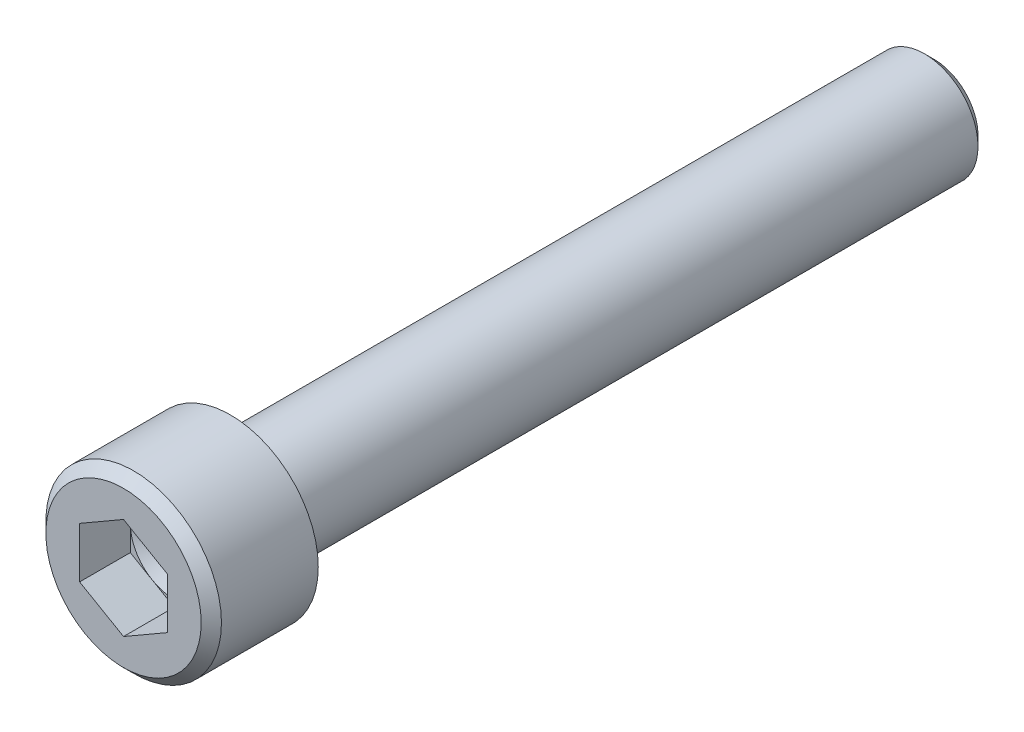
ISO-10303-21;
HEADER;
FILE_DESCRIPTION(('STEP AP214'),'2;1');
FILE_NAME('part.step','',(''),(''),'','','');
FILE_SCHEMA(('AUTOMOTIVE_DESIGN { 1 0 10303 214 1 1 1 1 }'));
ENDSEC;
DATA;
#1=APPLICATION_CONTEXT('core data for automotive mechanical design processes');
#2=APPLICATION_PROTOCOL_DEFINITION('international standard','automotive_design',2000,#1);
#3=PRODUCT_CONTEXT('',#1,'mechanical');
#4=PRODUCT('Part','Part','',(#3));
#5=PRODUCT_RELATED_PRODUCT_CATEGORY('part','',(#4));
#6=PRODUCT_DEFINITION_FORMATION('','',#4);
#7=PRODUCT_DEFINITION_CONTEXT('part definition',#1,'design');
#8=PRODUCT_DEFINITION('design','',#6,#7);
#9=PRODUCT_DEFINITION_SHAPE('','',#8);
#10=(LENGTH_UNIT() NAMED_UNIT(*) SI_UNIT(.MILLI.,.METRE.));
#11=(NAMED_UNIT(*) PLANE_ANGLE_UNIT() SI_UNIT($,.RADIAN.));
#12=(NAMED_UNIT(*) SI_UNIT($,.STERADIAN.) SOLID_ANGLE_UNIT());
#13=UNCERTAINTY_MEASURE_WITH_UNIT(LENGTH_MEASURE(1.E-05),#10,'distance_accuracy_value','');
#14=(GEOMETRIC_REPRESENTATION_CONTEXT(3) GLOBAL_UNCERTAINTY_ASSIGNED_CONTEXT((#13)) GLOBAL_UNIT_ASSIGNED_CONTEXT((#10,
#11,#12)) REPRESENTATION_CONTEXT('',''));
#15=CARTESIAN_POINT('',(0.,0.,0.));
#16=DIRECTION('',(0.,0.,1.));
#17=DIRECTION('',(1.,0.,0.));
#18=AXIS2_PLACEMENT_3D('',#15,#16,#17);
#19=CARTESIAN_POINT('',(0.,0.,2.54));
#20=DIRECTION('',(0.,0.,1.));
#21=DIRECTION('',(1.,0.,0.));
#22=AXIS2_PLACEMENT_3D('',#19,#20,#21);
#23=PLANE('',#22);
#24=DIRECTION('',(0.,1.,0.));
#25=VECTOR('',#24,1.);
#26=CARTESIAN_POINT('',(-1.9812,0.,2.54));
#27=LINE('',#26,#25);
#28=CARTESIAN_POINT('',(-1.9812,0.,2.54));
#29=VERTEX_POINT('',#28);
#30=CARTESIAN_POINT('',(-1.9812,1.14384635331848,2.54));
#31=VERTEX_POINT('',#30);
#32=EDGE_CURVE('E396',#29,#31,#27,.T.);
#33=ORIENTED_EDGE('',*,*,#32,.F.);
#34=CARTESIAN_POINT('',(0.,0.,2.54));
#35=DIRECTION('',(0.,0.,-1.));
#36=DIRECTION('',(-1.,0.,0.));
#37=AXIS2_PLACEMENT_3D('',#34,#35,#36);
#38=CIRCLE('',#37,1.9812);
#39=CARTESIAN_POINT('',(-0.9906,1.71576952997773,2.54));
#40=VERTEX_POINT('',#39);
#41=EDGE_CURVE('E33',#29,#40,#38,.T.);
#42=ORIENTED_EDGE('',*,*,#41,.T.);
#43=DIRECTION('',(0.866025403784439,0.5,0.));
#44=VECTOR('',#43,1.);
#45=CARTESIAN_POINT('',(0.163354175866616,2.38200528404682,2.54));
#46=LINE('',#45,#44);
#47=EDGE_CURVE('E391',#31,#40,#46,.T.);
#48=ORIENTED_EDGE('',*,*,#47,.F.);
#49=EDGE_LOOP('',(#33,#42,#48));
#50=FACE_BOUND('',#49,.T.);
#51=ADVANCED_FACE('F17',(#50),#23,.T.);
#52=CARTESIAN_POINT('',(0.,2.28769270663697,2.54));
#53=VERTEX_POINT('',#52);
#54=EDGE_CURVE('E389',#40,#53,#46,.T.);
#55=ORIENTED_EDGE('',*,*,#54,.F.);
#56=CARTESIAN_POINT('',(0.9906,1.71576952997773,2.54));
#57=VERTEX_POINT('',#56);
#58=EDGE_CURVE('E224',#40,#57,#38,.T.);
#59=ORIENTED_EDGE('',*,*,#58,.T.);
#60=DIRECTION('',(0.866025403784439,-0.5,0.));
#61=VECTOR('',#60,1.);
#62=CARTESIAN_POINT('',(-0.163354175866613,2.38200528404681,2.54));
#63=LINE('',#62,#61);
#64=EDGE_CURVE('E381',#53,#57,#63,.T.);
#65=ORIENTED_EDGE('',*,*,#64,.F.);
#66=EDGE_LOOP('',(#55,#59,#65));
#67=FACE_BOUND('',#66,.T.);
#68=ADVANCED_FACE('F105',(#67),#23,.T.);
#69=CARTESIAN_POINT('',(1.9812,1.14384635331849,2.54));
#70=VERTEX_POINT('',#69);
#71=EDGE_CURVE('E189',#57,#70,#63,.T.);
#72=ORIENTED_EDGE('',*,*,#71,.F.);
#73=CARTESIAN_POINT('',(1.9812,0.,2.54));
#74=VERTEX_POINT('',#73);
#75=EDGE_CURVE('E378',#57,#74,#38,.T.);
#76=ORIENTED_EDGE('',*,*,#75,.T.);
#77=DIRECTION('',(0.,-1.,0.));
#78=VECTOR('',#77,1.);
#79=CARTESIAN_POINT('',(1.9812,0.,2.54));
#80=LINE('',#79,#78);
#81=EDGE_CURVE('E159',#70,#74,#80,.T.);
#82=ORIENTED_EDGE('',*,*,#81,.F.);
#83=EDGE_LOOP('',(#72,#76,#82));
#84=FACE_BOUND('',#83,.T.);
#85=ADVANCED_FACE('F111',(#84),#23,.T.);
#86=CARTESIAN_POINT('',(1.9812,-1.14384635331849,2.54));
#87=VERTEX_POINT('',#86);
#88=EDGE_CURVE('E155',#74,#87,#80,.T.);
#89=ORIENTED_EDGE('',*,*,#88,.F.);
#90=CARTESIAN_POINT('',(0.9906,-1.71576952997773,2.54));
#91=VERTEX_POINT('',#90);
#92=EDGE_CURVE('E415',#74,#91,#38,.T.);
#93=ORIENTED_EDGE('',*,*,#92,.T.);
#94=DIRECTION('',(-0.866025403784438,-0.5,0.));
#95=VECTOR('',#94,1.);
#96=CARTESIAN_POINT('',(2.14455417586661,-1.04953377590865,2.54));
#97=LINE('',#96,#95);
#98=EDGE_CURVE('E148',#87,#91,#97,.T.);
#99=ORIENTED_EDGE('',*,*,#98,.F.);
#100=EDGE_LOOP('',(#89,#93,#99));
#101=FACE_BOUND('',#100,.T.);
#102=ADVANCED_FACE('F129',(#101),#23,.T.);
#103=CARTESIAN_POINT('',(0.,-2.28769270663697,2.54));
#104=VERTEX_POINT('',#103);
#105=EDGE_CURVE('E141',#91,#104,#97,.T.);
#106=ORIENTED_EDGE('',*,*,#105,.F.);
#107=CARTESIAN_POINT('',(-0.9906,-1.71576952997773,2.54));
#108=VERTEX_POINT('',#107);
#109=EDGE_CURVE('E143',#91,#108,#38,.T.);
#110=ORIENTED_EDGE('',*,*,#109,.T.);
#111=DIRECTION('',(-0.866025403784439,0.5,0.));
#112=VECTOR('',#111,1.);
#113=CARTESIAN_POINT('',(-2.14455417586661,-1.04953377590865,2.54));
#114=LINE('',#113,#112);
#115=EDGE_CURVE('E145',#104,#108,#114,.T.);
#116=ORIENTED_EDGE('',*,*,#115,.F.);
#117=EDGE_LOOP('',(#106,#110,#116));
#118=FACE_BOUND('',#117,.T.);
#119=ADVANCED_FACE('F119',(#118),#23,.T.);
#120=CARTESIAN_POINT('',(0.,0.,4.826));
#121=DIRECTION('',(0.,0.,1.));
#122=DIRECTION('',(1.,0.,0.));
#123=AXIS2_PLACEMENT_3D('',#120,#121,#122);
#124=PLANE('',#123);
#125=CARTESIAN_POINT('',(0.,0.,4.826));
#126=DIRECTION('',(0.,0.,1.));
#127=DIRECTION('',(1.,0.,0.));
#128=AXIS2_PLACEMENT_3D('',#125,#126,#127);
#129=CIRCLE('',#128,3.5052);
#130=CARTESIAN_POINT('',(3.5052,0.,4.826));
#131=VERTEX_POINT('',#130);
#132=EDGE_CURVE('E210',#131,#131,#129,.T.);
#133=ORIENTED_EDGE('',*,*,#132,.T.);
#134=EDGE_LOOP('',(#133));
#135=FACE_BOUND('',#134,.T.);
#136=DIRECTION('',(0.866025403784439,0.5,0.));
#137=VECTOR('',#136,1.);
#138=CARTESIAN_POINT('',(0.163354175866616,2.38200528404682,4.826));
#139=LINE('',#138,#137);
#140=CARTESIAN_POINT('',(-1.9812,1.14384635331848,4.826));
#141=VERTEX_POINT('',#140);
#142=CARTESIAN_POINT('',(0.,2.28769270663697,4.826));
#143=VERTEX_POINT('',#142);
#144=EDGE_CURVE('E171',#141,#143,#139,.T.);
#145=ORIENTED_EDGE('',*,*,#144,.T.);
#146=DIRECTION('',(0.866025403784439,-0.5,0.));
#147=VECTOR('',#146,1.);
#148=CARTESIAN_POINT('',(-0.163354175866613,2.38200528404681,4.826));
#149=LINE('',#148,#147);
#150=CARTESIAN_POINT('',(1.9812,1.14384635331849,4.826));
#151=VERTEX_POINT('',#150);
#152=EDGE_CURVE('E167',#143,#151,#149,.T.);
#153=ORIENTED_EDGE('',*,*,#152,.T.);
#154=DIRECTION('',(0.,-1.,0.));
#155=VECTOR('',#154,1.);
#156=CARTESIAN_POINT('',(1.9812,0.,4.826));
#157=LINE('',#156,#155);
#158=CARTESIAN_POINT('',(1.9812,-1.14384635331849,4.826));
#159=VERTEX_POINT('',#158);
#160=EDGE_CURVE('E185',#151,#159,#157,.T.);
#161=ORIENTED_EDGE('',*,*,#160,.T.);
#162=DIRECTION('',(-0.866025403784438,-0.5,0.));
#163=VECTOR('',#162,1.);
#164=CARTESIAN_POINT('',(2.14455417586661,-1.04953377590865,4.826));
#165=LINE('',#164,#163);
#166=CARTESIAN_POINT('',(0.,-2.28769270663697,4.826));
#167=VERTEX_POINT('',#166);
#168=EDGE_CURVE('E41',#159,#167,#165,.T.);
#169=ORIENTED_EDGE('',*,*,#168,.T.);
#170=DIRECTION('',(-0.866025403784439,0.5,0.));
#171=VECTOR('',#170,1.);
#172=CARTESIAN_POINT('',(-2.14455417586661,-1.04953377590865,4.826));
#173=LINE('',#172,#171);
#174=CARTESIAN_POINT('',(-1.9812,-1.14384635331849,4.826));
#175=VERTEX_POINT('',#174);
#176=EDGE_CURVE('E179',#167,#175,#173,.T.);
#177=ORIENTED_EDGE('',*,*,#176,.T.);
#178=DIRECTION('',(0.,1.,0.));
#179=VECTOR('',#178,1.);
#180=CARTESIAN_POINT('',(-1.9812,0.,4.826));
#181=LINE('',#180,#179);
#182=EDGE_CURVE('E175',#175,#141,#181,.T.);
#183=ORIENTED_EDGE('',*,*,#182,.T.);
#184=EDGE_LOOP('',(#145,#153,#161,#169,#177,#183));
#185=FACE_BOUND('',#184,.T.);
#186=ADVANCED_FACE('F128',(#135,#185),#124,.T.);
#187=CARTESIAN_POINT('',(0.,0.,4.826));
#188=DIRECTION('',(0.,0.,-1.));
#189=DIRECTION('',(-1.,0.,0.));
#190=AXIS2_PLACEMENT_3D('',#187,#188,#189);
#191=CYLINDRICAL_SURFACE('',#190,3.9624);
#192=CARTESIAN_POINT('',(0.,0.,4.3688));
#193=DIRECTION('',(0.,0.,1.));
#194=DIRECTION('',(1.,0.,0.));
#195=AXIS2_PLACEMENT_3D('',#192,#193,#194);
#196=CIRCLE('',#195,3.9624);
#197=CARTESIAN_POINT('',(3.9624,0.,4.3688));
#198=VERTEX_POINT('',#197);
#199=EDGE_CURVE('E214',#198,#198,#196,.F.);
#200=ORIENTED_EDGE('',*,*,#199,.T.);
#201=EDGE_LOOP('',(#200));
#202=FACE_BOUND('',#201,.T.);
#203=CARTESIAN_POINT('',(0.,0.,0.));
#204=DIRECTION('',(0.,0.,1.));
#205=DIRECTION('',(1.,0.,0.));
#206=AXIS2_PLACEMENT_3D('',#203,#204,#205);
#207=CIRCLE('',#206,3.9624);
#208=CARTESIAN_POINT('',(3.9624,0.,0.));
#209=VERTEX_POINT('',#208);
#210=EDGE_CURVE('E206',#209,#209,#207,.T.);
#211=ORIENTED_EDGE('',*,*,#210,.T.);
#212=EDGE_LOOP('',(#211));
#213=FACE_BOUND('',#212,.T.);
#214=ADVANCED_FACE('F134',(#202,#213),#191,.T.);
#215=CARTESIAN_POINT('',(0.,0.,0.));
#216=DIRECTION('',(0.,0.,1.));
#217=DIRECTION('',(1.,0.,0.));
#218=AXIS2_PLACEMENT_3D('',#215,#216,#217);
#219=PLANE('',#218);
#220=CARTESIAN_POINT('',(0.,0.,0.));
#221=DIRECTION('',(0.,0.,1.));
#222=DIRECTION('',(1.,0.,0.));
#223=AXIS2_PLACEMENT_3D('',#220,#221,#222);
#224=CIRCLE('',#223,2.5654);
#225=CARTESIAN_POINT('',(2.5654,0.,0.));
#226=VERTEX_POINT('',#225);
#227=EDGE_CURVE('E223',#226,#226,#224,.T.);
#228=ORIENTED_EDGE('',*,*,#227,.T.);
#229=EDGE_LOOP('',(#228));
#230=FACE_BOUND('',#229,.T.);
#231=ORIENTED_EDGE('',*,*,#210,.F.);
#232=EDGE_LOOP('',(#231));
#233=FACE_BOUND('',#232,.T.);
#234=ADVANCED_FACE('F322',(#230,#233),#219,.F.);
#235=CARTESIAN_POINT('',(0.,0.,4.826));
#236=DIRECTION('',(0.,0.,-1.));
#237=DIRECTION('',(-1.,0.,0.));
#238=AXIS2_PLACEMENT_3D('',#235,#236,#237);
#239=CONICAL_SURFACE('',#238,3.5052,0.785398163397449);
#240=ORIENTED_EDGE('',*,*,#199,.F.);
#241=EDGE_LOOP('',(#240));
#242=FACE_BOUND('',#241,.T.);
#243=ORIENTED_EDGE('',*,*,#132,.F.);
#244=EDGE_LOOP('',(#243));
#245=FACE_BOUND('',#244,.T.);
#246=ADVANCED_FACE('F313',(#242,#245),#239,.T.);
#247=CARTESIAN_POINT('',(-0.163354175866613,2.38200528404681,2.54));
#248=DIRECTION('',(-0.5,-0.866025403784439,0.));
#249=DIRECTION('',(0.866025403784439,-0.5,0.));
#250=AXIS2_PLACEMENT_3D('',#247,#248,#249);
#251=PLANE('',#250);
#252=ORIENTED_EDGE('',*,*,#152,.F.);
#253=DIRECTION('',(0.,0.,1.));
#254=VECTOR('',#253,1.);
#255=CARTESIAN_POINT('',(0.,2.28769270663697,2.54));
#256=LINE('',#255,#254);
#257=EDGE_CURVE('E203',#53,#143,#256,.T.);
#258=ORIENTED_EDGE('',*,*,#257,.F.);
#259=ORIENTED_EDGE('',*,*,#64,.T.);
#260=ORIENTED_EDGE('',*,*,#71,.T.);
#261=DIRECTION('',(0.,0.,1.));
#262=VECTOR('',#261,1.);
#263=CARTESIAN_POINT('',(1.9812,1.14384635331849,2.54));
#264=LINE('',#263,#262);
#265=EDGE_CURVE('E166',#70,#151,#264,.T.);
#266=ORIENTED_EDGE('',*,*,#265,.T.);
#267=EDGE_LOOP('',(#252,#258,#259,#260,#266));
#268=FACE_BOUND('',#267,.T.);
#269=ADVANCED_FACE('F304',(#268),#251,.T.);
#270=CARTESIAN_POINT('',(0.163354175866616,2.38200528404682,2.54));
#271=DIRECTION('',(0.5,-0.866025403784438,0.));
#272=DIRECTION('',(0.866025403784438,0.5,0.));
#273=AXIS2_PLACEMENT_3D('',#270,#271,#272);
#274=PLANE('',#273);
#275=ORIENTED_EDGE('',*,*,#144,.F.);
#276=DIRECTION('',(0.,0.,1.));
#277=VECTOR('',#276,1.);
#278=CARTESIAN_POINT('',(-1.9812,1.14384635331848,2.54));
#279=LINE('',#278,#277);
#280=EDGE_CURVE('E200',#31,#141,#279,.T.);
#281=ORIENTED_EDGE('',*,*,#280,.F.);
#282=ORIENTED_EDGE('',*,*,#47,.T.);
#283=ORIENTED_EDGE('',*,*,#54,.T.);
#284=ORIENTED_EDGE('',*,*,#257,.T.);
#285=EDGE_LOOP('',(#275,#281,#282,#283,#284));
#286=FACE_BOUND('',#285,.T.);
#287=ADVANCED_FACE('F295',(#286),#274,.T.);
#288=CARTESIAN_POINT('',(-1.9812,0.,2.54));
#289=DIRECTION('',(1.,0.,0.));
#290=DIRECTION('',(0.,1.,0.));
#291=AXIS2_PLACEMENT_3D('',#288,#289,#290);
#292=PLANE('',#291);
#293=ORIENTED_EDGE('',*,*,#182,.F.);
#294=DIRECTION('',(0.,0.,1.));
#295=VECTOR('',#294,1.);
#296=CARTESIAN_POINT('',(-1.9812,-1.14384635331849,2.54));
#297=LINE('',#296,#295);
#298=CARTESIAN_POINT('',(-1.9812,-1.14384635331849,2.54));
#299=VERTEX_POINT('',#298);
#300=EDGE_CURVE('E197',#299,#175,#297,.T.);
#301=ORIENTED_EDGE('',*,*,#300,.F.);
#302=EDGE_CURVE('E397',#299,#29,#27,.T.);
#303=ORIENTED_EDGE('',*,*,#302,.T.);
#304=ORIENTED_EDGE('',*,*,#32,.T.);
#305=ORIENTED_EDGE('',*,*,#280,.T.);
#306=EDGE_LOOP('',(#293,#301,#303,#304,#305));
#307=FACE_BOUND('',#306,.T.);
#308=ADVANCED_FACE('F286',(#307),#292,.T.);
#309=CARTESIAN_POINT('',(-2.14455417586661,-1.04953377590865,2.54));
#310=DIRECTION('',(0.5,0.866025403784439,0.));
#311=DIRECTION('',(-0.866025403784439,0.5,0.));
#312=AXIS2_PLACEMENT_3D('',#309,#310,#311);
#313=PLANE('',#312);
#314=ORIENTED_EDGE('',*,*,#176,.F.);
#315=DIRECTION('',(0.,0.,1.));
#316=VECTOR('',#315,1.);
#317=CARTESIAN_POINT('',(0.,-2.28769270663697,2.54));
#318=LINE('',#317,#316);
#319=EDGE_CURVE('E194',#104,#167,#318,.T.);
#320=ORIENTED_EDGE('',*,*,#319,.F.);
#321=ORIENTED_EDGE('',*,*,#115,.T.);
#322=EDGE_CURVE('E400',#108,#299,#114,.T.);
#323=ORIENTED_EDGE('',*,*,#322,.T.);
#324=ORIENTED_EDGE('',*,*,#300,.T.);
#325=EDGE_LOOP('',(#314,#320,#321,#323,#324));
#326=FACE_BOUND('',#325,.T.);
#327=ADVANCED_FACE('F278',(#326),#313,.T.);
#328=CARTESIAN_POINT('',(2.14455417586661,-1.04953377590865,2.54));
#329=DIRECTION('',(-0.5,0.866025403784438,0.));
#330=DIRECTION('',(-0.866025403784438,-0.5,0.));
#331=AXIS2_PLACEMENT_3D('',#328,#329,#330);
#332=PLANE('',#331);
#333=ORIENTED_EDGE('',*,*,#168,.F.);
#334=DIRECTION('',(0.,0.,1.));
#335=VECTOR('',#334,1.);
#336=CARTESIAN_POINT('',(1.9812,-1.14384635331849,2.54));
#337=LINE('',#336,#335);
#338=EDGE_CURVE('E151',#87,#159,#337,.T.);
#339=ORIENTED_EDGE('',*,*,#338,.F.);
#340=ORIENTED_EDGE('',*,*,#98,.T.);
#341=ORIENTED_EDGE('',*,*,#105,.T.);
#342=ORIENTED_EDGE('',*,*,#319,.T.);
#343=EDGE_LOOP('',(#333,#339,#340,#341,#342));
#344=FACE_BOUND('',#343,.T.);
#345=ADVANCED_FACE('F124',(#344),#332,.T.);
#346=CARTESIAN_POINT('',(1.9812,0.,2.54));
#347=DIRECTION('',(-1.,0.,0.));
#348=DIRECTION('',(0.,-1.,0.));
#349=AXIS2_PLACEMENT_3D('',#346,#347,#348);
#350=PLANE('',#349);
#351=ORIENTED_EDGE('',*,*,#160,.F.);
#352=ORIENTED_EDGE('',*,*,#265,.F.);
#353=ORIENTED_EDGE('',*,*,#81,.T.);
#354=ORIENTED_EDGE('',*,*,#88,.T.);
#355=ORIENTED_EDGE('',*,*,#338,.T.);
#356=EDGE_LOOP('',(#351,#352,#353,#354,#355));
#357=FACE_BOUND('',#356,.T.);
#358=ADVANCED_FACE('F117',(#357),#350,.T.);
#359=ORIENTED_EDGE('',*,*,#322,.F.);
#360=EDGE_CURVE('E218',#108,#29,#38,.T.);
#361=ORIENTED_EDGE('',*,*,#360,.T.);
#362=ORIENTED_EDGE('',*,*,#302,.F.);
#363=EDGE_LOOP('',(#359,#361,#362));
#364=FACE_BOUND('',#363,.T.);
#365=ADVANCED_FACE('F108',(#364),#23,.T.);
#366=CARTESIAN_POINT('',(0.,0.,-31.75));
#367=DIRECTION('',(0.,0.,1.));
#368=DIRECTION('',(1.,0.,0.));
#369=AXIS2_PLACEMENT_3D('',#366,#367,#368);
#370=CYLINDRICAL_SURFACE('',#369,2.413);
#371=CARTESIAN_POINT('',(0.,0.,-31.32105761938));
#372=DIRECTION('',(0.,0.,-1.));
#373=DIRECTION('',(-1.,0.,0.));
#374=AXIS2_PLACEMENT_3D('',#371,#372,#373);
#375=CIRCLE('',#374,2.413);
#376=CARTESIAN_POINT('',(-2.413,0.,-31.32105761938));
#377=VERTEX_POINT('',#376);
#378=EDGE_CURVE('E11',#377,#377,#375,.F.);
#379=ORIENTED_EDGE('',*,*,#378,.T.);
#380=EDGE_LOOP('',(#379));
#381=FACE_BOUND('',#380,.T.);
#382=CARTESIAN_POINT('',(0.,0.,-0.152399999999997));
#383=DIRECTION('',(0.,0.,1.));
#384=DIRECTION('',(1.,0.,0.));
#385=AXIS2_PLACEMENT_3D('',#382,#383,#384);
#386=CIRCLE('',#385,2.413);
#387=CARTESIAN_POINT('',(2.413,0.,-0.152399999999997));
#388=VERTEX_POINT('',#387);
#389=EDGE_CURVE('E219',#388,#388,#386,.F.);
#390=ORIENTED_EDGE('',*,*,#389,.T.);
#391=EDGE_LOOP('',(#390));
#392=FACE_BOUND('',#391,.T.);
#393=ADVANCED_FACE('F101',(#381,#392),#370,.T.);
#394=CARTESIAN_POINT('',(0.,0.,-31.75));
#395=DIRECTION('',(0.,0.,-1.));
#396=DIRECTION('',(1.,0.,0.));
#397=AXIS2_PLACEMENT_3D('',#394,#395,#396);
#398=PLANE('',#397);
#399=CARTESIAN_POINT('',(0.,0.,-31.75));
#400=DIRECTION('',(0.,0.,-1.));
#401=DIRECTION('',(-1.,0.,0.));
#402=AXIS2_PLACEMENT_3D('',#399,#400,#401);
#403=CIRCLE('',#402,1.98405761938);
#404=CARTESIAN_POINT('',(-1.98405761938,0.,-31.75));
#405=VERTEX_POINT('',#404);
#406=EDGE_CURVE('E26',#405,#405,#403,.T.);
#407=ORIENTED_EDGE('',*,*,#406,.T.);
#408=EDGE_LOOP('',(#407));
#409=FACE_BOUND('',#408,.T.);
#410=ADVANCED_FACE('F94',(#409),#398,.T.);
#411=CARTESIAN_POINT('',(0.,0.,1.39615364668151));
#412=DIRECTION('',(0.,0.,1.));
#413=DIRECTION('',(1.,0.,0.));
#414=AXIS2_PLACEMENT_3D('',#411,#412,#413);
#415=CONICAL_SURFACE('',#414,0.,1.0471975511966);
#416=ORIENTED_EDGE('',*,*,#41,.F.);
#417=ORIENTED_EDGE('',*,*,#360,.F.);
#418=ORIENTED_EDGE('',*,*,#109,.F.);
#419=ORIENTED_EDGE('',*,*,#92,.F.);
#420=ORIENTED_EDGE('',*,*,#75,.F.);
#421=ORIENTED_EDGE('',*,*,#58,.F.);
#422=EDGE_LOOP('',(#416,#417,#418,#419,#420,#421));
#423=FACE_BOUND('',#422,.T.);
#424=CARTESIAN_POINT('',(0.,0.,1.39615364668151));
#425=VERTEX_POINT('',#424);
#426=VERTEX_LOOP('',#425);
#427=FACE_BOUND('',#426,.T.);
#428=ADVANCED_FACE('F91',(#423,#427),#415,.F.);
#429=CARTESIAN_POINT('',(0.,0.,-0.152399999999997));
#430=DIRECTION('',(0.,0.,1.));
#431=DIRECTION('',(1.,0.,0.));
#432=AXIS2_PLACEMENT_3D('',#429,#430,#431);
#433=TOROIDAL_SURFACE('',#432,2.5654,0.1524);
#434=ORIENTED_EDGE('',*,*,#227,.F.);
#435=EDGE_LOOP('',(#434));
#436=FACE_BOUND('',#435,.T.);
#437=ORIENTED_EDGE('',*,*,#389,.F.);
#438=EDGE_LOOP('',(#437));
#439=FACE_BOUND('',#438,.T.);
#440=ADVANCED_FACE('F93',(#436,#439),#433,.F.);
#441=CARTESIAN_POINT('',(0.,0.,-31.75));
#442=DIRECTION('',(0.,0.,1.));
#443=DIRECTION('',(1.,0.,0.));
#444=AXIS2_PLACEMENT_3D('',#441,#442,#443);
#445=CONICAL_SURFACE('',#444,1.98405761938,0.785398163397445);
#446=ORIENTED_EDGE('',*,*,#378,.F.);
#447=EDGE_LOOP('',(#446));
#448=FACE_BOUND('',#447,.T.);
#449=ORIENTED_EDGE('',*,*,#406,.F.);
#450=EDGE_LOOP('',(#449));
#451=FACE_BOUND('',#450,.T.);
#452=ADVANCED_FACE('F19',(#448,#451),#445,.T.);
#453=CLOSED_SHELL('',(#51,#68,#85,#102,#119,#186,#214,#234,#246,#269,#287,#308,#327,#345,#358,
#365,#393,#410,#428,#440,#452));
#454=MANIFOLD_SOLID_BREP('B1',#453);
#455=ADVANCED_BREP_SHAPE_REPRESENTATION('',(#18,#454),#14);
#456=SHAPE_DEFINITION_REPRESENTATION(#9,#455);
ENDSEC;
END-ISO-10303-21;
